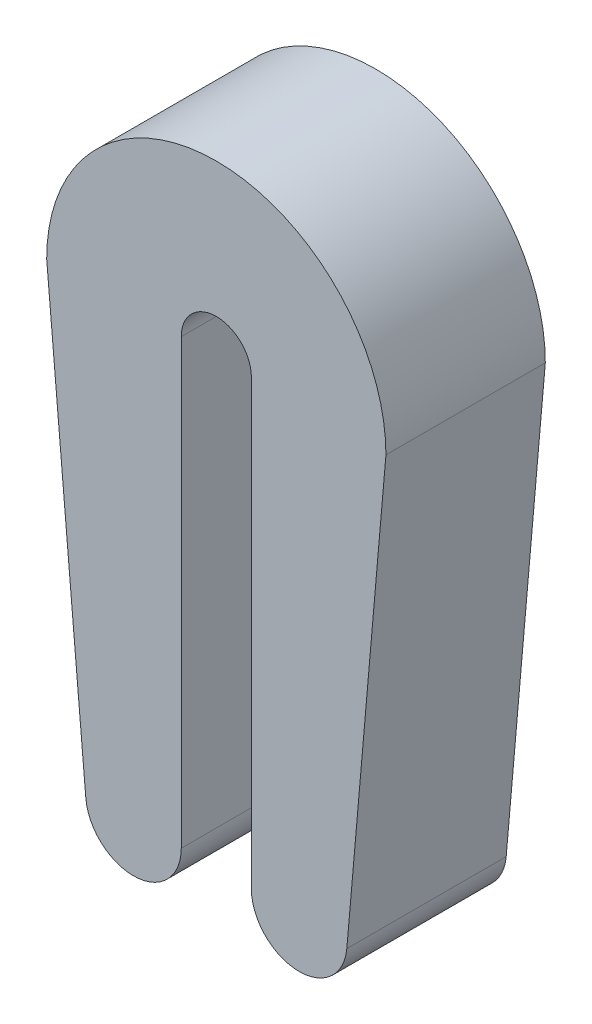
ISO-10303-21;
HEADER;
FILE_DESCRIPTION(('STEP AP214'),'2;1');
FILE_NAME('part.step','',(''),(''),'','','');
FILE_SCHEMA(('AUTOMOTIVE_DESIGN { 1 0 10303 214 1 1 1 1 }'));
ENDSEC;
DATA;
#1=APPLICATION_CONTEXT('core data for automotive mechanical design processes');
#2=APPLICATION_PROTOCOL_DEFINITION('international standard','automotive_design',2000,#1);
#3=PRODUCT_CONTEXT('',#1,'mechanical');
#4=PRODUCT('Part','Part','',(#3));
#5=PRODUCT_RELATED_PRODUCT_CATEGORY('part','',(#4));
#6=PRODUCT_DEFINITION_FORMATION('','',#4);
#7=PRODUCT_DEFINITION_CONTEXT('part definition',#1,'design');
#8=PRODUCT_DEFINITION('design','',#6,#7);
#9=PRODUCT_DEFINITION_SHAPE('','',#8);
#10=(LENGTH_UNIT() NAMED_UNIT(*) SI_UNIT(.MILLI.,.METRE.));
#11=(NAMED_UNIT(*) PLANE_ANGLE_UNIT() SI_UNIT($,.RADIAN.));
#12=(NAMED_UNIT(*) SI_UNIT($,.STERADIAN.) SOLID_ANGLE_UNIT());
#13=UNCERTAINTY_MEASURE_WITH_UNIT(LENGTH_MEASURE(1.E-05),#10,'distance_accuracy_value','');
#14=(GEOMETRIC_REPRESENTATION_CONTEXT(3) GLOBAL_UNCERTAINTY_ASSIGNED_CONTEXT((#13)) GLOBAL_UNIT_ASSIGNED_CONTEXT((#10,
#11,#12)) REPRESENTATION_CONTEXT('',''));
#15=CARTESIAN_POINT('',(0.,0.,0.));
#16=DIRECTION('',(0.,0.,1.));
#17=DIRECTION('',(1.,0.,0.));
#18=AXIS2_PLACEMENT_3D('',#15,#16,#17);
#19=CARTESIAN_POINT('',(0.,0.,5.));
#20=DIRECTION('',(0.,0.,-1.));
#21=DIRECTION('',(-1.,0.,0.));
#22=AXIS2_PLACEMENT_3D('',#19,#20,#21);
#23=CYLINDRICAL_SURFACE('',#22,1.1);
#24=CARTESIAN_POINT('',(0.,0.,0.));
#25=DIRECTION('',(0.,0.,-1.));
#26=DIRECTION('',(-1.,0.,0.));
#27=AXIS2_PLACEMENT_3D('',#24,#25,#26);
#28=CIRCLE('',#27,1.1);
#29=CARTESIAN_POINT('',(-1.1,0.,0.));
#30=VERTEX_POINT('',#29);
#31=CARTESIAN_POINT('',(1.1,0.,0.));
#32=VERTEX_POINT('',#31);
#33=EDGE_CURVE('E131',#30,#32,#28,.T.);
#34=ORIENTED_EDGE('',*,*,#33,.T.);
#35=DIRECTION('',(0.,0.,-1.));
#36=VECTOR('',#35,1.);
#37=CARTESIAN_POINT('',(1.1,0.,5.));
#38=LINE('',#37,#36);
#39=CARTESIAN_POINT('',(1.1,0.,5.));
#40=VERTEX_POINT('',#39);
#41=EDGE_CURVE('E11',#40,#32,#38,.T.);
#42=ORIENTED_EDGE('',*,*,#41,.F.);
#43=CARTESIAN_POINT('',(0.,0.,5.));
#44=DIRECTION('',(0.,0.,-1.));
#45=DIRECTION('',(-1.,0.,0.));
#46=AXIS2_PLACEMENT_3D('',#43,#44,#45);
#47=CIRCLE('',#46,1.1);
#48=CARTESIAN_POINT('',(-1.1,0.,5.));
#49=VERTEX_POINT('',#48);
#50=EDGE_CURVE('E145',#49,#40,#47,.T.);
#51=ORIENTED_EDGE('',*,*,#50,.F.);
#52=DIRECTION('',(0.,0.,-1.));
#53=VECTOR('',#52,1.);
#54=CARTESIAN_POINT('',(-1.1,0.,5.));
#55=LINE('',#54,#53);
#56=EDGE_CURVE('E127',#49,#30,#55,.T.);
#57=ORIENTED_EDGE('',*,*,#56,.T.);
#58=EDGE_LOOP('',(#34,#42,#51,#57));
#59=FACE_BOUND('',#58,.T.);
#60=ADVANCED_FACE('F35',(#59),#23,.F.);
#61=CARTESIAN_POINT('',(1.1,0.,5.));
#62=DIRECTION('',(1.,0.,0.));
#63=DIRECTION('',(0.,1.,0.));
#64=AXIS2_PLACEMENT_3D('',#61,#62,#63);
#65=PLANE('',#64);
#66=DIRECTION('',(0.,-1.,0.));
#67=VECTOR('',#66,1.);
#68=CARTESIAN_POINT('',(1.1,0.,0.));
#69=LINE('',#68,#67);
#70=CARTESIAN_POINT('',(1.1,-13.9,0.));
#71=VERTEX_POINT('',#70);
#72=EDGE_CURVE('E134',#32,#71,#69,.T.);
#73=ORIENTED_EDGE('',*,*,#72,.T.);
#74=DIRECTION('',(0.,0.,-1.));
#75=VECTOR('',#74,1.);
#76=CARTESIAN_POINT('',(1.1,-13.9,5.));
#77=LINE('',#76,#75);
#78=CARTESIAN_POINT('',(1.1,-13.9,5.));
#79=VERTEX_POINT('',#78);
#80=EDGE_CURVE('E43',#79,#71,#77,.T.);
#81=ORIENTED_EDGE('',*,*,#80,.F.);
#82=DIRECTION('',(0.,-1.,0.));
#83=VECTOR('',#82,1.);
#84=CARTESIAN_POINT('',(1.1,0.,5.));
#85=LINE('',#84,#83);
#86=EDGE_CURVE('E94',#40,#79,#85,.T.);
#87=ORIENTED_EDGE('',*,*,#86,.F.);
#88=ORIENTED_EDGE('',*,*,#41,.T.);
#89=EDGE_LOOP('',(#73,#81,#87,#88));
#90=FACE_BOUND('',#89,.T.);
#91=ADVANCED_FACE('F180',(#90),#65,.F.);
#92=CARTESIAN_POINT('',(2.6,-13.9,5.));
#93=DIRECTION('',(0.,0.,-1.));
#94=DIRECTION('',(-1.,0.,0.));
#95=AXIS2_PLACEMENT_3D('',#92,#93,#94);
#96=CYLINDRICAL_SURFACE('',#95,1.5);
#97=CARTESIAN_POINT('',(2.6,-13.9,0.));
#98=DIRECTION('',(0.,0.,1.));
#99=DIRECTION('',(-1.,0.,0.));
#100=AXIS2_PLACEMENT_3D('',#97,#98,#99);
#101=CIRCLE('',#100,1.5);
#102=CARTESIAN_POINT('',(4.09429204713762,-14.0307336141215,0.));
#103=VERTEX_POINT('',#102);
#104=EDGE_CURVE('E136',#71,#103,#101,.T.);
#105=ORIENTED_EDGE('',*,*,#104,.T.);
#106=DIRECTION('',(0.,0.,-1.));
#107=VECTOR('',#106,1.);
#108=CARTESIAN_POINT('',(4.09429204713762,-14.0307336141215,5.));
#109=LINE('',#108,#107);
#110=CARTESIAN_POINT('',(4.09429204713762,-14.0307336141215,5.));
#111=VERTEX_POINT('',#110);
#112=EDGE_CURVE('E152',#111,#103,#109,.T.);
#113=ORIENTED_EDGE('',*,*,#112,.F.);
#114=CARTESIAN_POINT('',(2.6,-13.9,5.));
#115=DIRECTION('',(0.,0.,1.));
#116=DIRECTION('',(-1.,0.,0.));
#117=AXIS2_PLACEMENT_3D('',#114,#115,#116);
#118=CIRCLE('',#117,1.5);
#119=EDGE_CURVE('E160',#79,#111,#118,.T.);
#120=ORIENTED_EDGE('',*,*,#119,.F.);
#121=ORIENTED_EDGE('',*,*,#80,.T.);
#122=EDGE_LOOP('',(#105,#113,#120,#121));
#123=FACE_BOUND('',#122,.T.);
#124=ADVANCED_FACE('F158',(#123),#96,.T.);
#125=CARTESIAN_POINT('',(4.09429204713762,-14.0307336141215,5.));
#126=DIRECTION('',(-0.996194698091746,0.0871557427476517,0.));
#127=DIRECTION('',(-0.0871557427476517,-0.996194698091746,0.));
#128=AXIS2_PLACEMENT_3D('',#125,#126,#127);
#129=PLANE('',#128);
#130=DIRECTION('',(0.0871557427476517,0.996194698091746,0.));
#131=VECTOR('',#130,1.);
#132=CARTESIAN_POINT('',(4.09429204713762,-14.0307336141215,0.));
#133=LINE('',#132,#131);
#134=CARTESIAN_POINT('',(5.32182217932527,0.,0.));
#135=VERTEX_POINT('',#134);
#136=EDGE_CURVE('E138',#103,#135,#133,.T.);
#137=ORIENTED_EDGE('',*,*,#136,.T.);
#138=DIRECTION('',(0.,0.,-1.));
#139=VECTOR('',#138,1.);
#140=CARTESIAN_POINT('',(5.32182217932527,0.,5.));
#141=LINE('',#140,#139);
#142=CARTESIAN_POINT('',(5.32182217932527,0.,5.));
#143=VERTEX_POINT('',#142);
#144=EDGE_CURVE('E149',#143,#135,#141,.T.);
#145=ORIENTED_EDGE('',*,*,#144,.F.);
#146=DIRECTION('',(0.0871557427476517,0.996194698091746,0.));
#147=VECTOR('',#146,1.);
#148=CARTESIAN_POINT('',(4.09429204713762,-14.0307336141215,5.));
#149=LINE('',#148,#147);
#150=EDGE_CURVE('E172',#111,#143,#149,.T.);
#151=ORIENTED_EDGE('',*,*,#150,.F.);
#152=ORIENTED_EDGE('',*,*,#112,.T.);
#153=EDGE_LOOP('',(#137,#145,#151,#152));
#154=FACE_BOUND('',#153,.T.);
#155=ADVANCED_FACE('F168',(#154),#129,.F.);
#156=CARTESIAN_POINT('',(0.,0.,5.));
#157=DIRECTION('',(0.,0.,-1.));
#158=DIRECTION('',(-1.,0.,0.));
#159=AXIS2_PLACEMENT_3D('',#156,#157,#158);
#160=CYLINDRICAL_SURFACE('',#159,5.32182217932527);
#161=CARTESIAN_POINT('',(0.,0.,0.));
#162=DIRECTION('',(0.,0.,1.));
#163=DIRECTION('',(-1.,0.,0.));
#164=AXIS2_PLACEMENT_3D('',#161,#162,#163);
#165=CIRCLE('',#164,5.32182217932527);
#166=CARTESIAN_POINT('',(-5.32182217932527,0.,0.));
#167=VERTEX_POINT('',#166);
#168=EDGE_CURVE('E140',#135,#167,#165,.T.);
#169=ORIENTED_EDGE('',*,*,#168,.T.);
#170=DIRECTION('',(0.,0.,-1.));
#171=VECTOR('',#170,1.);
#172=CARTESIAN_POINT('',(-5.32182217932527,0.,5.));
#173=LINE('',#172,#171);
#174=CARTESIAN_POINT('',(-5.32182217932527,0.,5.));
#175=VERTEX_POINT('',#174);
#176=EDGE_CURVE('E122',#175,#167,#173,.T.);
#177=ORIENTED_EDGE('',*,*,#176,.F.);
#178=CARTESIAN_POINT('',(0.,0.,5.));
#179=DIRECTION('',(0.,0.,1.));
#180=DIRECTION('',(-1.,0.,0.));
#181=AXIS2_PLACEMENT_3D('',#178,#179,#180);
#182=CIRCLE('',#181,5.32182217932527);
#183=EDGE_CURVE('E113',#143,#175,#182,.T.);
#184=ORIENTED_EDGE('',*,*,#183,.F.);
#185=ORIENTED_EDGE('',*,*,#144,.T.);
#186=EDGE_LOOP('',(#169,#177,#184,#185));
#187=FACE_BOUND('',#186,.T.);
#188=ADVANCED_FACE('F171',(#187),#160,.T.);
#189=CARTESIAN_POINT('',(-4.09429204713762,-14.0307336141215,5.));
#190=DIRECTION('',(0.996194698091746,0.0871557427476517,0.));
#191=DIRECTION('',(-0.0871557427476517,0.996194698091746,0.));
#192=AXIS2_PLACEMENT_3D('',#189,#190,#191);
#193=PLANE('',#192);
#194=DIRECTION('',(0.0871557427476517,-0.996194698091746,0.));
#195=VECTOR('',#194,1.);
#196=CARTESIAN_POINT('',(-4.09429204713762,-14.0307336141215,0.));
#197=LINE('',#196,#195);
#198=CARTESIAN_POINT('',(-4.09429204713762,-14.0307336141215,0.));
#199=VERTEX_POINT('',#198);
#200=EDGE_CURVE('E121',#167,#199,#197,.T.);
#201=ORIENTED_EDGE('',*,*,#200,.T.);
#202=DIRECTION('',(0.,0.,-1.));
#203=VECTOR('',#202,1.);
#204=CARTESIAN_POINT('',(-4.09429204713762,-14.0307336141215,5.));
#205=LINE('',#204,#203);
#206=CARTESIAN_POINT('',(-4.09429204713762,-14.0307336141215,5.));
#207=VERTEX_POINT('',#206);
#208=EDGE_CURVE('E118',#207,#199,#205,.T.);
#209=ORIENTED_EDGE('',*,*,#208,.F.);
#210=DIRECTION('',(0.0871557427476517,-0.996194698091746,0.));
#211=VECTOR('',#210,1.);
#212=CARTESIAN_POINT('',(-4.09429204713762,-14.0307336141215,5.));
#213=LINE('',#212,#211);
#214=EDGE_CURVE('E107',#175,#207,#213,.T.);
#215=ORIENTED_EDGE('',*,*,#214,.F.);
#216=ORIENTED_EDGE('',*,*,#176,.T.);
#217=EDGE_LOOP('',(#201,#209,#215,#216));
#218=FACE_BOUND('',#217,.T.);
#219=ADVANCED_FACE('F119',(#218),#193,.F.);
#220=CARTESIAN_POINT('',(-2.6,-13.9,5.));
#221=DIRECTION('',(0.,0.,-1.));
#222=DIRECTION('',(-1.,0.,0.));
#223=AXIS2_PLACEMENT_3D('',#220,#221,#222);
#224=CYLINDRICAL_SURFACE('',#223,1.5);
#225=CARTESIAN_POINT('',(-2.6,-13.9,0.));
#226=DIRECTION('',(0.,0.,1.));
#227=DIRECTION('',(1.,0.,0.));
#228=AXIS2_PLACEMENT_3D('',#225,#226,#227);
#229=CIRCLE('',#228,1.5);
#230=CARTESIAN_POINT('',(-1.1,-13.9,0.));
#231=VERTEX_POINT('',#230);
#232=EDGE_CURVE('E80',#199,#231,#229,.T.);
#233=ORIENTED_EDGE('',*,*,#232,.T.);
#234=DIRECTION('',(0.,0.,-1.));
#235=VECTOR('',#234,1.);
#236=CARTESIAN_POINT('',(-1.1,-13.9,5.));
#237=LINE('',#236,#235);
#238=CARTESIAN_POINT('',(-1.1,-13.9,5.));
#239=VERTEX_POINT('',#238);
#240=EDGE_CURVE('E123',#239,#231,#237,.T.);
#241=ORIENTED_EDGE('',*,*,#240,.F.);
#242=CARTESIAN_POINT('',(-2.6,-13.9,5.));
#243=DIRECTION('',(0.,0.,1.));
#244=DIRECTION('',(1.,0.,0.));
#245=AXIS2_PLACEMENT_3D('',#242,#243,#244);
#246=CIRCLE('',#245,1.5);
#247=EDGE_CURVE('E111',#207,#239,#246,.T.);
#248=ORIENTED_EDGE('',*,*,#247,.F.);
#249=ORIENTED_EDGE('',*,*,#208,.T.);
#250=EDGE_LOOP('',(#233,#241,#248,#249));
#251=FACE_BOUND('',#250,.T.);
#252=ADVANCED_FACE('F125',(#251),#224,.T.);
#253=CARTESIAN_POINT('',(-1.1,0.,5.));
#254=DIRECTION('',(-1.,0.,0.));
#255=DIRECTION('',(0.,-1.,0.));
#256=AXIS2_PLACEMENT_3D('',#253,#254,#255);
#257=PLANE('',#256);
#258=DIRECTION('',(0.,1.,0.));
#259=VECTOR('',#258,1.);
#260=CARTESIAN_POINT('',(-1.1,0.,0.));
#261=LINE('',#260,#259);
#262=EDGE_CURVE('E86',#231,#30,#261,.T.);
#263=ORIENTED_EDGE('',*,*,#262,.T.);
#264=ORIENTED_EDGE('',*,*,#56,.F.);
#265=DIRECTION('',(0.,1.,0.));
#266=VECTOR('',#265,1.);
#267=CARTESIAN_POINT('',(-1.1,0.,5.));
#268=LINE('',#267,#266);
#269=EDGE_CURVE('E51',#239,#49,#268,.T.);
#270=ORIENTED_EDGE('',*,*,#269,.F.);
#271=ORIENTED_EDGE('',*,*,#240,.T.);
#272=EDGE_LOOP('',(#263,#264,#270,#271));
#273=FACE_BOUND('',#272,.T.);
#274=ADVANCED_FACE('F196',(#273),#257,.F.);
#275=CARTESIAN_POINT('',(0.,0.,5.));
#276=DIRECTION('',(0.,0.,-1.));
#277=DIRECTION('',(-1.,0.,0.));
#278=AXIS2_PLACEMENT_3D('',#275,#276,#277);
#279=PLANE('',#278);
#280=ORIENTED_EDGE('',*,*,#50,.T.);
#281=ORIENTED_EDGE('',*,*,#86,.T.);
#282=ORIENTED_EDGE('',*,*,#119,.T.);
#283=ORIENTED_EDGE('',*,*,#150,.T.);
#284=ORIENTED_EDGE('',*,*,#183,.T.);
#285=ORIENTED_EDGE('',*,*,#214,.T.);
#286=ORIENTED_EDGE('',*,*,#247,.T.);
#287=ORIENTED_EDGE('',*,*,#269,.T.);
#288=EDGE_LOOP('',(#280,#281,#282,#283,#284,#285,#286,#287));
#289=FACE_BOUND('',#288,.T.);
#290=ADVANCED_FACE('F109',(#289),#279,.F.);
#291=CARTESIAN_POINT('',(0.,0.,0.));
#292=DIRECTION('',(0.,0.,-1.));
#293=DIRECTION('',(-1.,0.,0.));
#294=AXIS2_PLACEMENT_3D('',#291,#292,#293);
#295=PLANE('',#294);
#296=ORIENTED_EDGE('',*,*,#33,.F.);
#297=ORIENTED_EDGE('',*,*,#262,.F.);
#298=ORIENTED_EDGE('',*,*,#232,.F.);
#299=ORIENTED_EDGE('',*,*,#200,.F.);
#300=ORIENTED_EDGE('',*,*,#168,.F.);
#301=ORIENTED_EDGE('',*,*,#136,.F.);
#302=ORIENTED_EDGE('',*,*,#104,.F.);
#303=ORIENTED_EDGE('',*,*,#72,.F.);
#304=EDGE_LOOP('',(#296,#297,#298,#299,#300,#301,#302,#303));
#305=FACE_BOUND('',#304,.T.);
#306=ADVANCED_FACE('F164',(#305),#295,.T.);
#307=CLOSED_SHELL('',(#60,#91,#124,#155,#188,#219,#252,#274,#290,#306));
#308=MANIFOLD_SOLID_BREP('B2',#307);
#309=ADVANCED_BREP_SHAPE_REPRESENTATION('',(#18,#308),#14);
#310=SHAPE_DEFINITION_REPRESENTATION(#9,#309);
ENDSEC;
END-ISO-10303-21;
